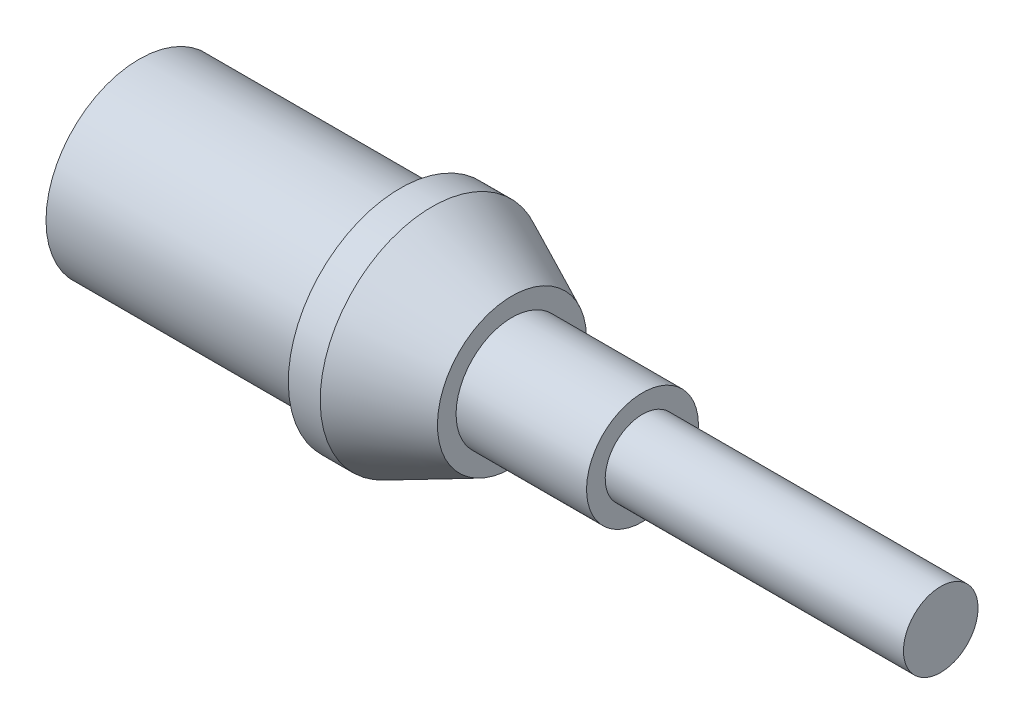
ISO-10303-21;
HEADER;
FILE_DESCRIPTION(('STEP AP214'),'2;1');
FILE_NAME('part.step','',(''),(''),'','','');
FILE_SCHEMA(('AUTOMOTIVE_DESIGN { 1 0 10303 214 1 1 1 1 }'));
ENDSEC;
DATA;
#1=APPLICATION_CONTEXT('core data for automotive mechanical design processes');
#2=APPLICATION_PROTOCOL_DEFINITION('international standard','automotive_design',2000,#1);
#3=PRODUCT_CONTEXT('',#1,'mechanical');
#4=PRODUCT('Part','Part','',(#3));
#5=PRODUCT_RELATED_PRODUCT_CATEGORY('part','',(#4));
#6=PRODUCT_DEFINITION_FORMATION('','',#4);
#7=PRODUCT_DEFINITION_CONTEXT('part definition',#1,'design');
#8=PRODUCT_DEFINITION('design','',#6,#7);
#9=PRODUCT_DEFINITION_SHAPE('','',#8);
#10=(LENGTH_UNIT() NAMED_UNIT(*) SI_UNIT(.MILLI.,.METRE.));
#11=(NAMED_UNIT(*) PLANE_ANGLE_UNIT() SI_UNIT($,.RADIAN.));
#12=(NAMED_UNIT(*) SI_UNIT($,.STERADIAN.) SOLID_ANGLE_UNIT());
#13=UNCERTAINTY_MEASURE_WITH_UNIT(LENGTH_MEASURE(1.E-05),#10,'distance_accuracy_value','');
#14=(GEOMETRIC_REPRESENTATION_CONTEXT(3) GLOBAL_UNCERTAINTY_ASSIGNED_CONTEXT((#13)) GLOBAL_UNIT_ASSIGNED_CONTEXT((#10,
#11,#12)) REPRESENTATION_CONTEXT('',''));
#15=CARTESIAN_POINT('',(0.,0.,0.));
#16=DIRECTION('',(0.,0.,1.));
#17=DIRECTION('',(1.,0.,0.));
#18=AXIS2_PLACEMENT_3D('',#15,#16,#17);
#19=CARTESIAN_POINT('',(6.99999999999999,3.,0.));
#20=DIRECTION('',(1.,0.,0.));
#21=DIRECTION('',(0.,1.,0.));
#22=AXIS2_PLACEMENT_3D('',#19,#20,#21);
#23=PLANE('',#22);
#24=CARTESIAN_POINT('',(7.,0.,0.));
#25=DIRECTION('',(-1.,0.,0.));
#26=DIRECTION('',(0.,-1.,0.));
#27=AXIS2_PLACEMENT_3D('',#24,#25,#26);
#28=CIRCLE('',#27,2.5);
#29=CARTESIAN_POINT('',(7.,-2.5,0.));
#30=VERTEX_POINT('',#29);
#31=EDGE_CURVE('E72',#30,#30,#28,.T.);
#32=ORIENTED_EDGE('',*,*,#31,.F.);
#33=EDGE_LOOP('',(#32));
#34=FACE_BOUND('',#33,.T.);
#35=CARTESIAN_POINT('',(6.99999999999999,0.,0.));
#36=DIRECTION('',(-1.,0.,0.));
#37=DIRECTION('',(0.,-1.,0.));
#38=AXIS2_PLACEMENT_3D('',#35,#36,#37);
#39=CIRCLE('',#38,3.);
#40=CARTESIAN_POINT('',(7.,-3.,0.));
#41=VERTEX_POINT('',#40);
#42=EDGE_CURVE('E51',#41,#41,#39,.T.);
#43=ORIENTED_EDGE('',*,*,#42,.T.);
#44=EDGE_LOOP('',(#43));
#45=FACE_BOUND('',#44,.T.);
#46=ADVANCED_FACE('F40',(#34,#45),#23,.F.);
#47=CARTESIAN_POINT('',(0.,0.,0.));
#48=DIRECTION('',(-1.,0.,0.));
#49=DIRECTION('',(0.,-1.,0.));
#50=AXIS2_PLACEMENT_3D('',#47,#48,#49);
#51=CYLINDRICAL_SURFACE('',#50,3.);
#52=CARTESIAN_POINT('',(7.85549307949042,0.,0.));
#53=DIRECTION('',(-1.,0.,0.));
#54=DIRECTION('',(0.,-1.,0.));
#55=AXIS2_PLACEMENT_3D('',#52,#53,#54);
#56=CIRCLE('',#55,3.);
#57=CARTESIAN_POINT('',(7.85549307949043,-3.,0.));
#58=VERTEX_POINT('',#57);
#59=EDGE_CURVE('E47',#58,#58,#56,.T.);
#60=ORIENTED_EDGE('',*,*,#59,.T.);
#61=EDGE_LOOP('',(#60));
#62=FACE_BOUND('',#61,.T.);
#63=ORIENTED_EDGE('',*,*,#42,.F.);
#64=EDGE_LOOP('',(#63));
#65=FACE_BOUND('',#64,.T.);
#66=ADVANCED_FACE('F80',(#62,#65),#51,.T.);
#67=CARTESIAN_POINT('',(9.99999999999999,3.,0.));
#68=DIRECTION('',(-1.,0.,0.));
#69=DIRECTION('',(0.,-1.,0.));
#70=AXIS2_PLACEMENT_3D('',#67,#68,#69);
#71=PLANE('',#70);
#72=CARTESIAN_POINT('',(10.,0.,0.));
#73=DIRECTION('',(-1.,0.,0.));
#74=DIRECTION('',(0.,-1.,0.));
#75=AXIS2_PLACEMENT_3D('',#72,#73,#74);
#76=CIRCLE('',#75,1.99999999999999);
#77=CARTESIAN_POINT('',(10.,-1.99999999999998,0.));
#78=VERTEX_POINT('',#77);
#79=EDGE_CURVE('E12',#78,#78,#76,.F.);
#80=ORIENTED_EDGE('',*,*,#79,.T.);
#81=EDGE_LOOP('',(#80));
#82=FACE_BOUND('',#81,.T.);
#83=CARTESIAN_POINT('',(10.,0.,0.));
#84=DIRECTION('',(-1.,0.,0.));
#85=DIRECTION('',(0.,-1.,0.));
#86=AXIS2_PLACEMENT_3D('',#83,#84,#85);
#87=CIRCLE('',#86,1.49999999999999);
#88=CARTESIAN_POINT('',(10.,-1.49999999999999,0.));
#89=VERTEX_POINT('',#88);
#90=EDGE_CURVE('E55',#89,#89,#87,.T.);
#91=ORIENTED_EDGE('',*,*,#90,.T.);
#92=EDGE_LOOP('',(#91));
#93=FACE_BOUND('',#92,.T.);
#94=ADVANCED_FACE('F84',(#82,#93),#71,.F.);
#95=CARTESIAN_POINT('',(0.,0.,0.));
#96=DIRECTION('',(-1.,0.,0.));
#97=DIRECTION('',(0.,-1.,0.));
#98=AXIS2_PLACEMENT_3D('',#95,#96,#97);
#99=CYLINDRICAL_SURFACE('',#98,1.49999999999999);
#100=ORIENTED_EDGE('',*,*,#90,.F.);
#101=EDGE_LOOP('',(#100));
#102=FACE_BOUND('',#101,.T.);
#103=CARTESIAN_POINT('',(13.5,0.,0.));
#104=DIRECTION('',(-1.,0.,0.));
#105=DIRECTION('',(0.,-1.,0.));
#106=AXIS2_PLACEMENT_3D('',#103,#104,#105);
#107=CIRCLE('',#106,1.49999999999999);
#108=CARTESIAN_POINT('',(13.5,-1.49999999999999,0.));
#109=VERTEX_POINT('',#108);
#110=EDGE_CURVE('E60',#109,#109,#107,.T.);
#111=ORIENTED_EDGE('',*,*,#110,.T.);
#112=EDGE_LOOP('',(#111));
#113=FACE_BOUND('',#112,.T.);
#114=ADVANCED_FACE('F89',(#102,#113),#99,.T.);
#115=CARTESIAN_POINT('',(13.5,1.5,0.));
#116=DIRECTION('',(-1.,0.,0.));
#117=DIRECTION('',(0.,-1.,0.));
#118=AXIS2_PLACEMENT_3D('',#115,#116,#117);
#119=PLANE('',#118);
#120=ORIENTED_EDGE('',*,*,#110,.F.);
#121=EDGE_LOOP('',(#120));
#122=FACE_BOUND('',#121,.T.);
#123=CARTESIAN_POINT('',(13.5,0.,0.));
#124=DIRECTION('',(-1.,0.,0.));
#125=DIRECTION('',(0.,-1.,0.));
#126=AXIS2_PLACEMENT_3D('',#123,#124,#125);
#127=CIRCLE('',#126,0.999999999999997);
#128=CARTESIAN_POINT('',(13.5,-0.999999999999993,0.));
#129=VERTEX_POINT('',#128);
#130=EDGE_CURVE('E63',#129,#129,#127,.T.);
#131=ORIENTED_EDGE('',*,*,#130,.T.);
#132=EDGE_LOOP('',(#131));
#133=FACE_BOUND('',#132,.T.);
#134=ADVANCED_FACE('F94',(#122,#133),#119,.F.);
#135=CARTESIAN_POINT('',(0.,0.,0.));
#136=DIRECTION('',(-1.,0.,0.));
#137=DIRECTION('',(0.,-1.,0.));
#138=AXIS2_PLACEMENT_3D('',#135,#136,#137);
#139=CYLINDRICAL_SURFACE('',#138,0.999999999999996);
#140=ORIENTED_EDGE('',*,*,#130,.F.);
#141=EDGE_LOOP('',(#140));
#142=FACE_BOUND('',#141,.T.);
#143=CARTESIAN_POINT('',(21.5,0.,0.));
#144=DIRECTION('',(-1.,0.,0.));
#145=DIRECTION('',(0.,-1.,0.));
#146=AXIS2_PLACEMENT_3D('',#143,#144,#145);
#147=CIRCLE('',#146,0.999999999999994);
#148=CARTESIAN_POINT('',(21.5,-0.999999999999988,0.));
#149=VERTEX_POINT('',#148);
#150=EDGE_CURVE('E66',#149,#149,#147,.T.);
#151=ORIENTED_EDGE('',*,*,#150,.T.);
#152=EDGE_LOOP('',(#151));
#153=FACE_BOUND('',#152,.T.);
#154=ADVANCED_FACE('F98',(#142,#153),#139,.T.);
#155=CARTESIAN_POINT('',(21.5,1.,0.));
#156=DIRECTION('',(-1.,0.,0.));
#157=DIRECTION('',(0.,-1.,0.));
#158=AXIS2_PLACEMENT_3D('',#155,#156,#157);
#159=PLANE('',#158);
#160=ORIENTED_EDGE('',*,*,#150,.F.);
#161=EDGE_LOOP('',(#160));
#162=FACE_BOUND('',#161,.T.);
#163=ADVANCED_FACE('F102',(#162),#159,.F.);
#164=CARTESIAN_POINT('',(0.,2.5,0.));
#165=DIRECTION('',(1.,0.,0.));
#166=DIRECTION('',(0.,1.,0.));
#167=AXIS2_PLACEMENT_3D('',#164,#165,#166);
#168=PLANE('',#167);
#169=CARTESIAN_POINT('',(0.,0.,0.));
#170=DIRECTION('',(-1.,0.,0.));
#171=DIRECTION('',(0.,-1.,0.));
#172=AXIS2_PLACEMENT_3D('',#169,#170,#171);
#173=CIRCLE('',#172,2.5);
#174=CARTESIAN_POINT('',(0.,-2.5,0.));
#175=VERTEX_POINT('',#174);
#176=EDGE_CURVE('E69',#175,#175,#173,.T.);
#177=ORIENTED_EDGE('',*,*,#176,.T.);
#178=EDGE_LOOP('',(#177));
#179=FACE_BOUND('',#178,.T.);
#180=ADVANCED_FACE('F106',(#179),#168,.F.);
#181=CARTESIAN_POINT('',(0.,0.,0.));
#182=DIRECTION('',(-1.,0.,0.));
#183=DIRECTION('',(0.,-1.,0.));
#184=AXIS2_PLACEMENT_3D('',#181,#182,#183);
#185=CYLINDRICAL_SURFACE('',#184,2.5);
#186=ORIENTED_EDGE('',*,*,#176,.F.);
#187=EDGE_LOOP('',(#186));
#188=FACE_BOUND('',#187,.T.);
#189=ORIENTED_EDGE('',*,*,#31,.T.);
#190=EDGE_LOOP('',(#189));
#191=FACE_BOUND('',#190,.T.);
#192=ADVANCED_FACE('F76',(#188,#191),#185,.T.);
#193=CARTESIAN_POINT('',(7.85549307949042,0.,0.));
#194=DIRECTION('',(-1.,0.,0.));
#195=DIRECTION('',(0.,-1.,0.));
#196=AXIS2_PLACEMENT_3D('',#193,#194,#195);
#197=CONICAL_SURFACE('',#196,3.,0.436332312998584);
#198=ORIENTED_EDGE('',*,*,#79,.F.);
#199=EDGE_LOOP('',(#198));
#200=FACE_BOUND('',#199,.T.);
#201=ORIENTED_EDGE('',*,*,#59,.F.);
#202=EDGE_LOOP('',(#201));
#203=FACE_BOUND('',#202,.T.);
#204=ADVANCED_FACE('F42',(#200,#203),#197,.T.);
#205=CLOSED_SHELL('',(#46,#66,#94,#114,#134,#154,#163,#180,#192,#204));
#206=MANIFOLD_SOLID_BREP('B2',#205);
#207=ADVANCED_BREP_SHAPE_REPRESENTATION('',(#18,#206),#14);
#208=SHAPE_DEFINITION_REPRESENTATION(#9,#207);
ENDSEC;
END-ISO-10303-21;
